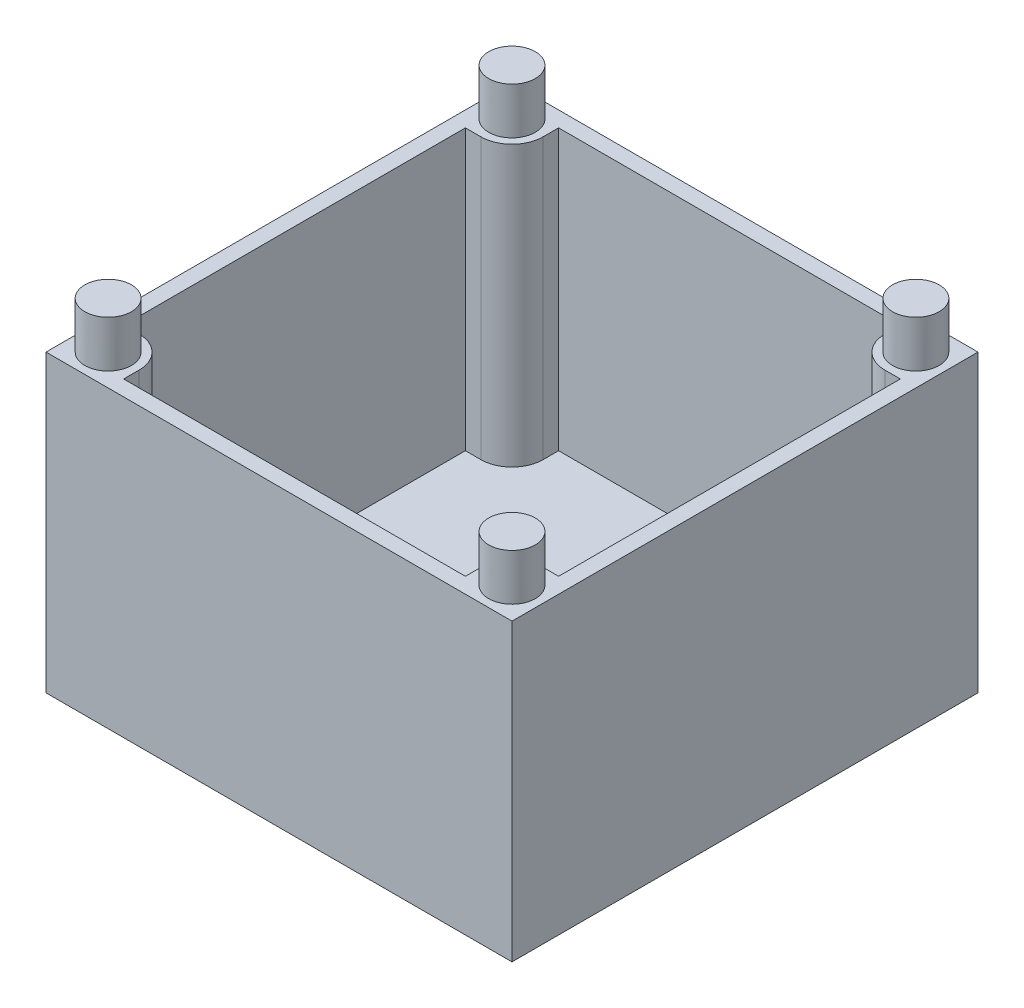
ISO-10303-21;
HEADER;
FILE_DESCRIPTION(('STEP AP214'),'2;1');
FILE_NAME('part.step','',(''),(''),'','','');
FILE_SCHEMA(('AUTOMOTIVE_DESIGN { 1 0 10303 214 1 1 1 1 }'));
ENDSEC;
DATA;
#1=APPLICATION_CONTEXT('core data for automotive mechanical design processes');
#2=APPLICATION_PROTOCOL_DEFINITION('international standard','automotive_design',2000,#1);
#3=PRODUCT_CONTEXT('',#1,'mechanical');
#4=PRODUCT('Part','Part','',(#3));
#5=PRODUCT_RELATED_PRODUCT_CATEGORY('part','',(#4));
#6=PRODUCT_DEFINITION_FORMATION('','',#4);
#7=PRODUCT_DEFINITION_CONTEXT('part definition',#1,'design');
#8=PRODUCT_DEFINITION('design','',#6,#7);
#9=PRODUCT_DEFINITION_SHAPE('','',#8);
#10=(LENGTH_UNIT() NAMED_UNIT(*) SI_UNIT(.MILLI.,.METRE.));
#11=(NAMED_UNIT(*) PLANE_ANGLE_UNIT() SI_UNIT($,.RADIAN.));
#12=(NAMED_UNIT(*) SI_UNIT($,.STERADIAN.) SOLID_ANGLE_UNIT());
#13=UNCERTAINTY_MEASURE_WITH_UNIT(LENGTH_MEASURE(1.E-05),#10,'distance_accuracy_value','');
#14=(GEOMETRIC_REPRESENTATION_CONTEXT(3) GLOBAL_UNCERTAINTY_ASSIGNED_CONTEXT((#13)) GLOBAL_UNIT_ASSIGNED_CONTEXT((#10,
#11,#12)) REPRESENTATION_CONTEXT('',''));
#15=CARTESIAN_POINT('',(0.,0.,0.));
#16=DIRECTION('',(0.,0.,1.));
#17=DIRECTION('',(1.,0.,0.));
#18=AXIS2_PLACEMENT_3D('',#15,#16,#17);
#19=CARTESIAN_POINT('',(-7.5,9.5,-7.5));
#20=DIRECTION('',(0.,-1.,0.));
#21=DIRECTION('',(0.,0.,-1.));
#22=AXIS2_PLACEMENT_3D('',#19,#20,#21);
#23=PLANE('',#22);
#24=CARTESIAN_POINT('',(6.5,9.5,6.5));
#25=DIRECTION('',(0.,-1.,0.));
#26=DIRECTION('',(0.,0.,-1.));
#27=AXIS2_PLACEMENT_3D('',#24,#25,#26);
#28=CIRCLE('',#27,0.749999999999999);
#29=CARTESIAN_POINT('',(6.5,9.5,5.75));
#30=VERTEX_POINT('',#29);
#31=EDGE_CURVE('E44',#30,#30,#28,.F.);
#32=ORIENTED_EDGE('',*,*,#31,.F.);
#33=EDGE_LOOP('',(#32));
#34=FACE_BOUND('',#33,.T.);
#35=CARTESIAN_POINT('',(-6.5,9.5,-6.5));
#36=DIRECTION('',(0.,-1.,0.));
#37=DIRECTION('',(0.,0.,-1.));
#38=AXIS2_PLACEMENT_3D('',#35,#36,#37);
#39=CIRCLE('',#38,0.749999999999999);
#40=CARTESIAN_POINT('',(-6.5,9.5,-7.25));
#41=VERTEX_POINT('',#40);
#42=EDGE_CURVE('E343',#41,#41,#39,.F.);
#43=ORIENTED_EDGE('',*,*,#42,.F.);
#44=EDGE_LOOP('',(#43));
#45=FACE_BOUND('',#44,.T.);
#46=DIRECTION('',(0.,0.,1.));
#47=VECTOR('',#46,1.);
#48=CARTESIAN_POINT('',(-5.5,9.5,6.5));
#49=LINE('',#48,#47);
#50=CARTESIAN_POINT('',(-5.5,9.5,6.5));
#51=VERTEX_POINT('',#50);
#52=CARTESIAN_POINT('',(-5.5,9.5,7.));
#53=VERTEX_POINT('',#52);
#54=EDGE_CURVE('E251',#51,#53,#49,.T.);
#55=ORIENTED_EDGE('',*,*,#54,.F.);
#56=CARTESIAN_POINT('',(-6.5,9.5,6.5));
#57=DIRECTION('',(0.,-1.,0.));
#58=DIRECTION('',(0.,0.,1.));
#59=AXIS2_PLACEMENT_3D('',#56,#57,#58);
#60=CIRCLE('',#59,1.);
#61=CARTESIAN_POINT('',(-6.5,9.5,5.5));
#62=VERTEX_POINT('',#61);
#63=EDGE_CURVE('E51',#62,#51,#60,.T.);
#64=ORIENTED_EDGE('',*,*,#63,.F.);
#65=DIRECTION('',(1.,0.,0.));
#66=VECTOR('',#65,1.);
#67=CARTESIAN_POINT('',(-6.5,9.5,5.5));
#68=LINE('',#67,#66);
#69=CARTESIAN_POINT('',(-7.,9.5,5.5));
#70=VERTEX_POINT('',#69);
#71=EDGE_CURVE('E204',#70,#62,#68,.T.);
#72=ORIENTED_EDGE('',*,*,#71,.F.);
#73=DIRECTION('',(0.,0.,1.));
#74=VECTOR('',#73,1.);
#75=CARTESIAN_POINT('',(-7.,9.5,5.5));
#76=LINE('',#75,#74);
#77=CARTESIAN_POINT('',(-7.,9.5,-5.5));
#78=VERTEX_POINT('',#77);
#79=EDGE_CURVE('E207',#78,#70,#76,.T.);
#80=ORIENTED_EDGE('',*,*,#79,.F.);
#81=DIRECTION('',(-1.,0.,0.));
#82=VECTOR('',#81,1.);
#83=CARTESIAN_POINT('',(-6.5,9.5,-5.5));
#84=LINE('',#83,#82);
#85=CARTESIAN_POINT('',(-6.5,9.5,-5.5));
#86=VERTEX_POINT('',#85);
#87=EDGE_CURVE('E286',#86,#78,#84,.T.);
#88=ORIENTED_EDGE('',*,*,#87,.F.);
#89=CARTESIAN_POINT('',(-6.5,9.5,-6.5));
#90=DIRECTION('',(0.,-1.,0.));
#91=DIRECTION('',(0.,0.,1.));
#92=AXIS2_PLACEMENT_3D('',#89,#90,#91);
#93=CIRCLE('',#92,1.);
#94=CARTESIAN_POINT('',(-5.5,9.5,-6.5));
#95=VERTEX_POINT('',#94);
#96=EDGE_CURVE('E283',#95,#86,#93,.T.);
#97=ORIENTED_EDGE('',*,*,#96,.F.);
#98=DIRECTION('',(0.,0.,1.));
#99=VECTOR('',#98,1.);
#100=CARTESIAN_POINT('',(-5.5,9.5,-6.5));
#101=LINE('',#100,#99);
#102=CARTESIAN_POINT('',(-5.5,9.5,-7.));
#103=VERTEX_POINT('',#102);
#104=EDGE_CURVE('E280',#103,#95,#101,.T.);
#105=ORIENTED_EDGE('',*,*,#104,.F.);
#106=DIRECTION('',(-1.,0.,0.));
#107=VECTOR('',#106,1.);
#108=CARTESIAN_POINT('',(-5.5,9.5,-7.));
#109=LINE('',#108,#107);
#110=CARTESIAN_POINT('',(5.5,9.5,-7.));
#111=VERTEX_POINT('',#110);
#112=EDGE_CURVE('E277',#111,#103,#109,.T.);
#113=ORIENTED_EDGE('',*,*,#112,.F.);
#114=DIRECTION('',(0.,0.,-1.));
#115=VECTOR('',#114,1.);
#116=CARTESIAN_POINT('',(5.5,9.5,-6.5));
#117=LINE('',#116,#115);
#118=CARTESIAN_POINT('',(5.5,9.5,-6.5));
#119=VERTEX_POINT('',#118);
#120=EDGE_CURVE('E274',#119,#111,#117,.T.);
#121=ORIENTED_EDGE('',*,*,#120,.F.);
#122=CARTESIAN_POINT('',(6.5,9.5,-6.5));
#123=DIRECTION('',(0.,-1.,0.));
#124=DIRECTION('',(0.,0.,1.));
#125=AXIS2_PLACEMENT_3D('',#122,#123,#124);
#126=CIRCLE('',#125,1.);
#127=CARTESIAN_POINT('',(6.5,9.5,-5.5));
#128=VERTEX_POINT('',#127);
#129=EDGE_CURVE('E271',#128,#119,#126,.T.);
#130=ORIENTED_EDGE('',*,*,#129,.F.);
#131=DIRECTION('',(-1.,0.,0.));
#132=VECTOR('',#131,1.);
#133=CARTESIAN_POINT('',(6.5,9.5,-5.5));
#134=LINE('',#133,#132);
#135=CARTESIAN_POINT('',(7.,9.5,-5.5));
#136=VERTEX_POINT('',#135);
#137=EDGE_CURVE('E268',#136,#128,#134,.T.);
#138=ORIENTED_EDGE('',*,*,#137,.F.);
#139=DIRECTION('',(0.,0.,-1.));
#140=VECTOR('',#139,1.);
#141=CARTESIAN_POINT('',(7.,9.5,5.5));
#142=LINE('',#141,#140);
#143=CARTESIAN_POINT('',(7.,9.5,5.5));
#144=VERTEX_POINT('',#143);
#145=EDGE_CURVE('E265',#144,#136,#142,.T.);
#146=ORIENTED_EDGE('',*,*,#145,.F.);
#147=DIRECTION('',(1.,0.,0.));
#148=VECTOR('',#147,1.);
#149=CARTESIAN_POINT('',(6.5,9.5,5.5));
#150=LINE('',#149,#148);
#151=CARTESIAN_POINT('',(6.5,9.5,5.5));
#152=VERTEX_POINT('',#151);
#153=EDGE_CURVE('E262',#152,#144,#150,.T.);
#154=ORIENTED_EDGE('',*,*,#153,.F.);
#155=CARTESIAN_POINT('',(6.5,9.5,6.5));
#156=DIRECTION('',(0.,-1.,0.));
#157=DIRECTION('',(0.,0.,1.));
#158=AXIS2_PLACEMENT_3D('',#155,#156,#157);
#159=CIRCLE('',#158,1.);
#160=CARTESIAN_POINT('',(5.5,9.5,6.5));
#161=VERTEX_POINT('',#160);
#162=EDGE_CURVE('E259',#161,#152,#159,.T.);
#163=ORIENTED_EDGE('',*,*,#162,.F.);
#164=DIRECTION('',(0.,0.,-1.));
#165=VECTOR('',#164,1.);
#166=CARTESIAN_POINT('',(5.5,9.5,6.5));
#167=LINE('',#166,#165);
#168=CARTESIAN_POINT('',(5.5,9.5,7.));
#169=VERTEX_POINT('',#168);
#170=EDGE_CURVE('E256',#169,#161,#167,.T.);
#171=ORIENTED_EDGE('',*,*,#170,.F.);
#172=DIRECTION('',(1.,0.,0.));
#173=VECTOR('',#172,1.);
#174=CARTESIAN_POINT('',(-5.5,9.5,7.));
#175=LINE('',#174,#173);
#176=EDGE_CURVE('E253',#53,#169,#175,.T.);
#177=ORIENTED_EDGE('',*,*,#176,.F.);
#178=EDGE_LOOP('',(#55,#64,#72,#80,#88,#97,#105,#113,#121,#130,#138,#146,#154,#163,#171,#177));
#179=FACE_BOUND('',#178,.T.);
#180=DIRECTION('',(0.,0.,1.));
#181=VECTOR('',#180,1.);
#182=CARTESIAN_POINT('',(-7.5,9.5,7.5));
#183=LINE('',#182,#181);
#184=CARTESIAN_POINT('',(-7.5,9.5,-7.5));
#185=VERTEX_POINT('',#184);
#186=CARTESIAN_POINT('',(-7.5,9.5,7.5));
#187=VERTEX_POINT('',#186);
#188=EDGE_CURVE('E321',#185,#187,#183,.T.);
#189=ORIENTED_EDGE('',*,*,#188,.T.);
#190=DIRECTION('',(1.,0.,0.));
#191=VECTOR('',#190,1.);
#192=CARTESIAN_POINT('',(-7.5,9.5,7.5));
#193=LINE('',#192,#191);
#194=CARTESIAN_POINT('',(7.5,9.5,7.5));
#195=VERTEX_POINT('',#194);
#196=EDGE_CURVE('E89',#187,#195,#193,.T.);
#197=ORIENTED_EDGE('',*,*,#196,.T.);
#198=DIRECTION('',(0.,0.,-1.));
#199=VECTOR('',#198,1.);
#200=CARTESIAN_POINT('',(7.5,9.5,7.5));
#201=LINE('',#200,#199);
#202=CARTESIAN_POINT('',(7.5,9.5,-7.5));
#203=VERTEX_POINT('',#202);
#204=EDGE_CURVE('E324',#195,#203,#201,.T.);
#205=ORIENTED_EDGE('',*,*,#204,.T.);
#206=DIRECTION('',(-1.,0.,0.));
#207=VECTOR('',#206,1.);
#208=CARTESIAN_POINT('',(-7.5,9.5,-7.5));
#209=LINE('',#208,#207);
#210=EDGE_CURVE('E60',#203,#185,#209,.T.);
#211=ORIENTED_EDGE('',*,*,#210,.T.);
#212=EDGE_LOOP('',(#189,#197,#205,#211));
#213=FACE_BOUND('',#212,.T.);
#214=CARTESIAN_POINT('',(-6.5,9.5,6.5));
#215=DIRECTION('',(0.,-1.,0.));
#216=DIRECTION('',(0.,0.,-1.));
#217=AXIS2_PLACEMENT_3D('',#214,#215,#216);
#218=CIRCLE('',#217,0.749999999999999);
#219=CARTESIAN_POINT('',(-6.5,9.5,5.75));
#220=VERTEX_POINT('',#219);
#221=EDGE_CURVE('E346',#220,#220,#218,.F.);
#222=ORIENTED_EDGE('',*,*,#221,.F.);
#223=EDGE_LOOP('',(#222));
#224=FACE_BOUND('',#223,.T.);
#225=CARTESIAN_POINT('',(6.5,9.5,-6.5));
#226=DIRECTION('',(0.,-1.,0.));
#227=DIRECTION('',(0.,0.,-1.));
#228=AXIS2_PLACEMENT_3D('',#225,#226,#227);
#229=CIRCLE('',#228,0.749999999999999);
#230=CARTESIAN_POINT('',(6.5,9.5,-7.25));
#231=VERTEX_POINT('',#230);
#232=EDGE_CURVE('E11',#231,#231,#229,.F.);
#233=ORIENTED_EDGE('',*,*,#232,.F.);
#234=EDGE_LOOP('',(#233));
#235=FACE_BOUND('',#234,.T.);
#236=ADVANCED_FACE('F36',(#34,#45,#179,#213,#224,#235),#23,.F.);
#237=CARTESIAN_POINT('',(-7.5,9.5,7.5));
#238=DIRECTION('',(1.,0.,0.));
#239=DIRECTION('',(0.,0.,-1.));
#240=AXIS2_PLACEMENT_3D('',#237,#238,#239);
#241=PLANE('',#240);
#242=DIRECTION('',(0.,0.,1.));
#243=VECTOR('',#242,1.);
#244=CARTESIAN_POINT('',(-7.5,0.,7.5));
#245=LINE('',#244,#243);
#246=CARTESIAN_POINT('',(-7.5,0.,-7.5));
#247=VERTEX_POINT('',#246);
#248=CARTESIAN_POINT('',(-7.5,0.,7.5));
#249=VERTEX_POINT('',#248);
#250=EDGE_CURVE('E293',#247,#249,#245,.T.);
#251=ORIENTED_EDGE('',*,*,#250,.T.);
#252=DIRECTION('',(0.,-1.,0.));
#253=VECTOR('',#252,1.);
#254=CARTESIAN_POINT('',(-7.5,9.5,7.5));
#255=LINE('',#254,#253);
#256=EDGE_CURVE('E341',#187,#249,#255,.T.);
#257=ORIENTED_EDGE('',*,*,#256,.F.);
#258=ORIENTED_EDGE('',*,*,#188,.F.);
#259=DIRECTION('',(0.,-1.,0.));
#260=VECTOR('',#259,1.);
#261=CARTESIAN_POINT('',(-7.5,9.5,-7.5));
#262=LINE('',#261,#260);
#263=EDGE_CURVE('E327',#185,#247,#262,.T.);
#264=ORIENTED_EDGE('',*,*,#263,.T.);
#265=EDGE_LOOP('',(#251,#257,#258,#264));
#266=FACE_BOUND('',#265,.T.);
#267=ADVANCED_FACE('F38',(#266),#241,.F.);
#268=CARTESIAN_POINT('',(-7.5,9.5,7.5));
#269=DIRECTION('',(0.,0.,-1.));
#270=DIRECTION('',(-1.,0.,0.));
#271=AXIS2_PLACEMENT_3D('',#268,#269,#270);
#272=PLANE('',#271);
#273=DIRECTION('',(1.,0.,0.));
#274=VECTOR('',#273,1.);
#275=CARTESIAN_POINT('',(-7.5,0.,7.5));
#276=LINE('',#275,#274);
#277=CARTESIAN_POINT('',(7.5,0.,7.5));
#278=VERTEX_POINT('',#277);
#279=EDGE_CURVE('E330',#249,#278,#276,.T.);
#280=ORIENTED_EDGE('',*,*,#279,.T.);
#281=DIRECTION('',(0.,-1.,0.));
#282=VECTOR('',#281,1.);
#283=CARTESIAN_POINT('',(7.5,9.5,7.5));
#284=LINE('',#283,#282);
#285=EDGE_CURVE('E338',#195,#278,#284,.T.);
#286=ORIENTED_EDGE('',*,*,#285,.F.);
#287=ORIENTED_EDGE('',*,*,#196,.F.);
#288=ORIENTED_EDGE('',*,*,#256,.T.);
#289=EDGE_LOOP('',(#280,#286,#287,#288));
#290=FACE_BOUND('',#289,.T.);
#291=ADVANCED_FACE('F472',(#290),#272,.F.);
#292=CARTESIAN_POINT('',(7.5,9.5,7.5));
#293=DIRECTION('',(-1.,0.,0.));
#294=DIRECTION('',(0.,0.,1.));
#295=AXIS2_PLACEMENT_3D('',#292,#293,#294);
#296=PLANE('',#295);
#297=DIRECTION('',(0.,0.,-1.));
#298=VECTOR('',#297,1.);
#299=CARTESIAN_POINT('',(7.5,0.,7.5));
#300=LINE('',#299,#298);
#301=CARTESIAN_POINT('',(7.5,0.,-7.5));
#302=VERTEX_POINT('',#301);
#303=EDGE_CURVE('E332',#278,#302,#300,.T.);
#304=ORIENTED_EDGE('',*,*,#303,.T.);
#305=DIRECTION('',(0.,-1.,0.));
#306=VECTOR('',#305,1.);
#307=CARTESIAN_POINT('',(7.5,9.5,-7.5));
#308=LINE('',#307,#306);
#309=EDGE_CURVE('E336',#203,#302,#308,.T.);
#310=ORIENTED_EDGE('',*,*,#309,.F.);
#311=ORIENTED_EDGE('',*,*,#204,.F.);
#312=ORIENTED_EDGE('',*,*,#285,.T.);
#313=EDGE_LOOP('',(#304,#310,#311,#312));
#314=FACE_BOUND('',#313,.T.);
#315=ADVANCED_FACE('F470',(#314),#296,.F.);
#316=CARTESIAN_POINT('',(-7.5,9.5,-7.5));
#317=DIRECTION('',(0.,0.,1.));
#318=DIRECTION('',(1.,0.,0.));
#319=AXIS2_PLACEMENT_3D('',#316,#317,#318);
#320=PLANE('',#319);
#321=DIRECTION('',(-1.,0.,0.));
#322=VECTOR('',#321,1.);
#323=CARTESIAN_POINT('',(-7.5,0.,-7.5));
#324=LINE('',#323,#322);
#325=EDGE_CURVE('E81',#302,#247,#324,.T.);
#326=ORIENTED_EDGE('',*,*,#325,.T.);
#327=ORIENTED_EDGE('',*,*,#263,.F.);
#328=ORIENTED_EDGE('',*,*,#210,.F.);
#329=ORIENTED_EDGE('',*,*,#309,.T.);
#330=EDGE_LOOP('',(#326,#327,#328,#329));
#331=FACE_BOUND('',#330,.T.);
#332=ADVANCED_FACE('F466',(#331),#320,.F.);
#333=CARTESIAN_POINT('',(-7.5,0.,-7.5));
#334=DIRECTION('',(0.,-1.,0.));
#335=DIRECTION('',(0.,0.,-1.));
#336=AXIS2_PLACEMENT_3D('',#333,#334,#335);
#337=PLANE('',#336);
#338=ORIENTED_EDGE('',*,*,#250,.F.);
#339=ORIENTED_EDGE('',*,*,#325,.F.);
#340=ORIENTED_EDGE('',*,*,#303,.F.);
#341=ORIENTED_EDGE('',*,*,#279,.F.);
#342=EDGE_LOOP('',(#338,#339,#340,#341));
#343=FACE_BOUND('',#342,.T.);
#344=ADVANCED_FACE('F462',(#343),#337,.T.);
#345=CARTESIAN_POINT('',(-6.5,0.5,6.5));
#346=DIRECTION('',(0.,1.,0.));
#347=DIRECTION('',(0.,0.,1.));
#348=AXIS2_PLACEMENT_3D('',#345,#346,#347);
#349=CYLINDRICAL_SURFACE('',#348,1.);
#350=ORIENTED_EDGE('',*,*,#63,.T.);
#351=DIRECTION('',(0.,1.,0.));
#352=VECTOR('',#351,1.);
#353=CARTESIAN_POINT('',(-5.5,0.5,6.5));
#354=LINE('',#353,#352);
#355=CARTESIAN_POINT('',(-5.5,0.5,6.5));
#356=VERTEX_POINT('',#355);
#357=EDGE_CURVE('E181',#356,#51,#354,.T.);
#358=ORIENTED_EDGE('',*,*,#357,.F.);
#359=CARTESIAN_POINT('',(-6.5,0.5,6.5));
#360=DIRECTION('',(0.,-1.,0.));
#361=DIRECTION('',(0.,0.,1.));
#362=AXIS2_PLACEMENT_3D('',#359,#360,#361);
#363=CIRCLE('',#362,1.);
#364=CARTESIAN_POINT('',(-6.5,0.5,5.5));
#365=VERTEX_POINT('',#364);
#366=EDGE_CURVE('E185',#365,#356,#363,.T.);
#367=ORIENTED_EDGE('',*,*,#366,.F.);
#368=DIRECTION('',(0.,1.,0.));
#369=VECTOR('',#368,1.);
#370=CARTESIAN_POINT('',(-6.5,0.5,5.5));
#371=LINE('',#370,#369);
#372=EDGE_CURVE('E291',#365,#62,#371,.T.);
#373=ORIENTED_EDGE('',*,*,#372,.T.);
#374=EDGE_LOOP('',(#350,#358,#367,#373));
#375=FACE_BOUND('',#374,.T.);
#376=ADVANCED_FACE('F183',(#375),#349,.T.);
#377=CARTESIAN_POINT('',(-6.5,0.5,5.5));
#378=DIRECTION('',(0.,0.,1.));
#379=DIRECTION('',(1.,0.,0.));
#380=AXIS2_PLACEMENT_3D('',#377,#378,#379);
#381=PLANE('',#380);
#382=ORIENTED_EDGE('',*,*,#71,.T.);
#383=ORIENTED_EDGE('',*,*,#372,.F.);
#384=DIRECTION('',(1.,0.,0.));
#385=VECTOR('',#384,1.);
#386=CARTESIAN_POINT('',(-6.5,0.5,5.5));
#387=LINE('',#386,#385);
#388=CARTESIAN_POINT('',(-7.,0.5,5.5));
#389=VERTEX_POINT('',#388);
#390=EDGE_CURVE('E191',#389,#365,#387,.T.);
#391=ORIENTED_EDGE('',*,*,#390,.F.);
#392=DIRECTION('',(0.,1.,0.));
#393=VECTOR('',#392,1.);
#394=CARTESIAN_POINT('',(-7.,0.5,5.5));
#395=LINE('',#394,#393);
#396=EDGE_CURVE('E294',#389,#70,#395,.T.);
#397=ORIENTED_EDGE('',*,*,#396,.T.);
#398=EDGE_LOOP('',(#382,#383,#391,#397));
#399=FACE_BOUND('',#398,.T.);
#400=ADVANCED_FACE('F403',(#399),#381,.F.);
#401=CARTESIAN_POINT('',(-7.,0.5,5.5));
#402=DIRECTION('',(-1.,0.,0.));
#403=DIRECTION('',(0.,0.,1.));
#404=AXIS2_PLACEMENT_3D('',#401,#402,#403);
#405=PLANE('',#404);
#406=ORIENTED_EDGE('',*,*,#79,.T.);
#407=ORIENTED_EDGE('',*,*,#396,.F.);
#408=DIRECTION('',(0.,0.,1.));
#409=VECTOR('',#408,1.);
#410=CARTESIAN_POINT('',(-7.,0.5,5.5));
#411=LINE('',#410,#409);
#412=CARTESIAN_POINT('',(-7.,0.5,-5.5));
#413=VERTEX_POINT('',#412);
#414=EDGE_CURVE('E247',#413,#389,#411,.T.);
#415=ORIENTED_EDGE('',*,*,#414,.F.);
#416=DIRECTION('',(0.,1.,0.));
#417=VECTOR('',#416,1.);
#418=CARTESIAN_POINT('',(-7.,0.5,-5.5));
#419=LINE('',#418,#417);
#420=EDGE_CURVE('E296',#413,#78,#419,.T.);
#421=ORIENTED_EDGE('',*,*,#420,.T.);
#422=EDGE_LOOP('',(#406,#407,#415,#421));
#423=FACE_BOUND('',#422,.T.);
#424=ADVANCED_FACE('F406',(#423),#405,.F.);
#425=CARTESIAN_POINT('',(-6.5,0.5,-5.5));
#426=DIRECTION('',(0.,0.,-1.));
#427=DIRECTION('',(-1.,0.,0.));
#428=AXIS2_PLACEMENT_3D('',#425,#426,#427);
#429=PLANE('',#428);
#430=ORIENTED_EDGE('',*,*,#87,.T.);
#431=ORIENTED_EDGE('',*,*,#420,.F.);
#432=DIRECTION('',(-1.,0.,0.));
#433=VECTOR('',#432,1.);
#434=CARTESIAN_POINT('',(-6.5,0.5,-5.5));
#435=LINE('',#434,#433);
#436=CARTESIAN_POINT('',(-6.5,0.5,-5.5));
#437=VERTEX_POINT('',#436);
#438=EDGE_CURVE('E244',#437,#413,#435,.T.);
#439=ORIENTED_EDGE('',*,*,#438,.F.);
#440=DIRECTION('',(0.,1.,0.));
#441=VECTOR('',#440,1.);
#442=CARTESIAN_POINT('',(-6.5,0.5,-5.5));
#443=LINE('',#442,#441);
#444=EDGE_CURVE('E298',#437,#86,#443,.T.);
#445=ORIENTED_EDGE('',*,*,#444,.T.);
#446=EDGE_LOOP('',(#430,#431,#439,#445));
#447=FACE_BOUND('',#446,.T.);
#448=ADVANCED_FACE('F410',(#447),#429,.F.);
#449=CARTESIAN_POINT('',(-6.5,0.5,-6.5));
#450=DIRECTION('',(0.,1.,0.));
#451=DIRECTION('',(0.,0.,1.));
#452=AXIS2_PLACEMENT_3D('',#449,#450,#451);
#453=CYLINDRICAL_SURFACE('',#452,1.);
#454=ORIENTED_EDGE('',*,*,#96,.T.);
#455=ORIENTED_EDGE('',*,*,#444,.F.);
#456=CARTESIAN_POINT('',(-6.5,0.5,-6.5));
#457=DIRECTION('',(0.,-1.,0.));
#458=DIRECTION('',(0.,0.,1.));
#459=AXIS2_PLACEMENT_3D('',#456,#457,#458);
#460=CIRCLE('',#459,1.);
#461=CARTESIAN_POINT('',(-5.5,0.5,-6.5));
#462=VERTEX_POINT('',#461);
#463=EDGE_CURVE('E241',#462,#437,#460,.T.);
#464=ORIENTED_EDGE('',*,*,#463,.F.);
#465=DIRECTION('',(0.,1.,0.));
#466=VECTOR('',#465,1.);
#467=CARTESIAN_POINT('',(-5.5,0.5,-6.5));
#468=LINE('',#467,#466);
#469=EDGE_CURVE('E300',#462,#95,#468,.T.);
#470=ORIENTED_EDGE('',*,*,#469,.T.);
#471=EDGE_LOOP('',(#454,#455,#464,#470));
#472=FACE_BOUND('',#471,.T.);
#473=ADVANCED_FACE('F414',(#472),#453,.T.);
#474=CARTESIAN_POINT('',(-5.5,0.5,-6.5));
#475=DIRECTION('',(-1.,0.,0.));
#476=DIRECTION('',(0.,0.,1.));
#477=AXIS2_PLACEMENT_3D('',#474,#475,#476);
#478=PLANE('',#477);
#479=ORIENTED_EDGE('',*,*,#104,.T.);
#480=ORIENTED_EDGE('',*,*,#469,.F.);
#481=DIRECTION('',(0.,0.,1.));
#482=VECTOR('',#481,1.);
#483=CARTESIAN_POINT('',(-5.5,0.5,-6.5));
#484=LINE('',#483,#482);
#485=CARTESIAN_POINT('',(-5.5,0.5,-7.));
#486=VERTEX_POINT('',#485);
#487=EDGE_CURVE('E238',#486,#462,#484,.T.);
#488=ORIENTED_EDGE('',*,*,#487,.F.);
#489=DIRECTION('',(0.,1.,0.));
#490=VECTOR('',#489,1.);
#491=CARTESIAN_POINT('',(-5.5,0.5,-7.));
#492=LINE('',#491,#490);
#493=EDGE_CURVE('E302',#486,#103,#492,.T.);
#494=ORIENTED_EDGE('',*,*,#493,.T.);
#495=EDGE_LOOP('',(#479,#480,#488,#494));
#496=FACE_BOUND('',#495,.T.);
#497=ADVANCED_FACE('F418',(#496),#478,.F.);
#498=CARTESIAN_POINT('',(-5.5,0.5,-7.));
#499=DIRECTION('',(0.,0.,-1.));
#500=DIRECTION('',(-1.,0.,0.));
#501=AXIS2_PLACEMENT_3D('',#498,#499,#500);
#502=PLANE('',#501);
#503=ORIENTED_EDGE('',*,*,#112,.T.);
#504=ORIENTED_EDGE('',*,*,#493,.F.);
#505=DIRECTION('',(-1.,0.,0.));
#506=VECTOR('',#505,1.);
#507=CARTESIAN_POINT('',(-5.5,0.5,-7.));
#508=LINE('',#507,#506);
#509=CARTESIAN_POINT('',(5.5,0.5,-7.));
#510=VERTEX_POINT('',#509);
#511=EDGE_CURVE('E235',#510,#486,#508,.T.);
#512=ORIENTED_EDGE('',*,*,#511,.F.);
#513=DIRECTION('',(0.,1.,0.));
#514=VECTOR('',#513,1.);
#515=CARTESIAN_POINT('',(5.5,0.5,-7.));
#516=LINE('',#515,#514);
#517=EDGE_CURVE('E304',#510,#111,#516,.T.);
#518=ORIENTED_EDGE('',*,*,#517,.T.);
#519=EDGE_LOOP('',(#503,#504,#512,#518));
#520=FACE_BOUND('',#519,.T.);
#521=ADVANCED_FACE('F422',(#520),#502,.F.);
#522=CARTESIAN_POINT('',(5.5,0.5,-6.5));
#523=DIRECTION('',(1.,0.,0.));
#524=DIRECTION('',(0.,0.,-1.));
#525=AXIS2_PLACEMENT_3D('',#522,#523,#524);
#526=PLANE('',#525);
#527=ORIENTED_EDGE('',*,*,#120,.T.);
#528=ORIENTED_EDGE('',*,*,#517,.F.);
#529=DIRECTION('',(0.,0.,-1.));
#530=VECTOR('',#529,1.);
#531=CARTESIAN_POINT('',(5.5,0.5,-6.5));
#532=LINE('',#531,#530);
#533=CARTESIAN_POINT('',(5.5,0.5,-6.5));
#534=VERTEX_POINT('',#533);
#535=EDGE_CURVE('E232',#534,#510,#532,.T.);
#536=ORIENTED_EDGE('',*,*,#535,.F.);
#537=DIRECTION('',(0.,1.,0.));
#538=VECTOR('',#537,1.);
#539=CARTESIAN_POINT('',(5.5,0.5,-6.5));
#540=LINE('',#539,#538);
#541=EDGE_CURVE('E306',#534,#119,#540,.T.);
#542=ORIENTED_EDGE('',*,*,#541,.T.);
#543=EDGE_LOOP('',(#527,#528,#536,#542));
#544=FACE_BOUND('',#543,.T.);
#545=ADVANCED_FACE('F426',(#544),#526,.F.);
#546=CARTESIAN_POINT('',(6.5,0.5,-6.5));
#547=DIRECTION('',(0.,1.,0.));
#548=DIRECTION('',(0.,0.,1.));
#549=AXIS2_PLACEMENT_3D('',#546,#547,#548);
#550=CYLINDRICAL_SURFACE('',#549,1.);
#551=ORIENTED_EDGE('',*,*,#129,.T.);
#552=ORIENTED_EDGE('',*,*,#541,.F.);
#553=CARTESIAN_POINT('',(6.5,0.5,-6.5));
#554=DIRECTION('',(0.,-1.,0.));
#555=DIRECTION('',(0.,0.,1.));
#556=AXIS2_PLACEMENT_3D('',#553,#554,#555);
#557=CIRCLE('',#556,1.);
#558=CARTESIAN_POINT('',(6.5,0.5,-5.5));
#559=VERTEX_POINT('',#558);
#560=EDGE_CURVE('E229',#559,#534,#557,.T.);
#561=ORIENTED_EDGE('',*,*,#560,.F.);
#562=DIRECTION('',(0.,1.,0.));
#563=VECTOR('',#562,1.);
#564=CARTESIAN_POINT('',(6.5,0.5,-5.5));
#565=LINE('',#564,#563);
#566=EDGE_CURVE('E308',#559,#128,#565,.T.);
#567=ORIENTED_EDGE('',*,*,#566,.T.);
#568=EDGE_LOOP('',(#551,#552,#561,#567));
#569=FACE_BOUND('',#568,.T.);
#570=ADVANCED_FACE('F430',(#569),#550,.T.);
#571=CARTESIAN_POINT('',(6.5,0.5,-5.5));
#572=DIRECTION('',(0.,0.,-1.));
#573=DIRECTION('',(-1.,0.,0.));
#574=AXIS2_PLACEMENT_3D('',#571,#572,#573);
#575=PLANE('',#574);
#576=ORIENTED_EDGE('',*,*,#137,.T.);
#577=ORIENTED_EDGE('',*,*,#566,.F.);
#578=DIRECTION('',(-1.,0.,0.));
#579=VECTOR('',#578,1.);
#580=CARTESIAN_POINT('',(6.5,0.5,-5.5));
#581=LINE('',#580,#579);
#582=CARTESIAN_POINT('',(7.,0.5,-5.5));
#583=VERTEX_POINT('',#582);
#584=EDGE_CURVE('E226',#583,#559,#581,.T.);
#585=ORIENTED_EDGE('',*,*,#584,.F.);
#586=DIRECTION('',(0.,1.,0.));
#587=VECTOR('',#586,1.);
#588=CARTESIAN_POINT('',(7.,0.5,-5.5));
#589=LINE('',#588,#587);
#590=EDGE_CURVE('E310',#583,#136,#589,.T.);
#591=ORIENTED_EDGE('',*,*,#590,.T.);
#592=EDGE_LOOP('',(#576,#577,#585,#591));
#593=FACE_BOUND('',#592,.T.);
#594=ADVANCED_FACE('F434',(#593),#575,.F.);
#595=CARTESIAN_POINT('',(7.,0.5,5.5));
#596=DIRECTION('',(1.,0.,0.));
#597=DIRECTION('',(0.,0.,-1.));
#598=AXIS2_PLACEMENT_3D('',#595,#596,#597);
#599=PLANE('',#598);
#600=ORIENTED_EDGE('',*,*,#145,.T.);
#601=ORIENTED_EDGE('',*,*,#590,.F.);
#602=DIRECTION('',(0.,0.,-1.));
#603=VECTOR('',#602,1.);
#604=CARTESIAN_POINT('',(7.,0.5,5.5));
#605=LINE('',#604,#603);
#606=CARTESIAN_POINT('',(7.,0.5,5.5));
#607=VERTEX_POINT('',#606);
#608=EDGE_CURVE('E223',#607,#583,#605,.T.);
#609=ORIENTED_EDGE('',*,*,#608,.F.);
#610=DIRECTION('',(0.,1.,0.));
#611=VECTOR('',#610,1.);
#612=CARTESIAN_POINT('',(7.,0.5,5.5));
#613=LINE('',#612,#611);
#614=EDGE_CURVE('E312',#607,#144,#613,.T.);
#615=ORIENTED_EDGE('',*,*,#614,.T.);
#616=EDGE_LOOP('',(#600,#601,#609,#615));
#617=FACE_BOUND('',#616,.T.);
#618=ADVANCED_FACE('F438',(#617),#599,.F.);
#619=CARTESIAN_POINT('',(6.5,0.5,5.5));
#620=DIRECTION('',(0.,0.,1.));
#621=DIRECTION('',(1.,0.,0.));
#622=AXIS2_PLACEMENT_3D('',#619,#620,#621);
#623=PLANE('',#622);
#624=ORIENTED_EDGE('',*,*,#153,.T.);
#625=ORIENTED_EDGE('',*,*,#614,.F.);
#626=DIRECTION('',(1.,0.,0.));
#627=VECTOR('',#626,1.);
#628=CARTESIAN_POINT('',(6.5,0.5,5.5));
#629=LINE('',#628,#627);
#630=CARTESIAN_POINT('',(6.5,0.5,5.5));
#631=VERTEX_POINT('',#630);
#632=EDGE_CURVE('E220',#631,#607,#629,.T.);
#633=ORIENTED_EDGE('',*,*,#632,.F.);
#634=DIRECTION('',(0.,1.,0.));
#635=VECTOR('',#634,1.);
#636=CARTESIAN_POINT('',(6.5,0.5,5.5));
#637=LINE('',#636,#635);
#638=EDGE_CURVE('E314',#631,#152,#637,.T.);
#639=ORIENTED_EDGE('',*,*,#638,.T.);
#640=EDGE_LOOP('',(#624,#625,#633,#639));
#641=FACE_BOUND('',#640,.T.);
#642=ADVANCED_FACE('F442',(#641),#623,.F.);
#643=CARTESIAN_POINT('',(6.5,0.5,6.5));
#644=DIRECTION('',(0.,1.,0.));
#645=DIRECTION('',(0.,0.,1.));
#646=AXIS2_PLACEMENT_3D('',#643,#644,#645);
#647=CYLINDRICAL_SURFACE('',#646,1.);
#648=ORIENTED_EDGE('',*,*,#162,.T.);
#649=ORIENTED_EDGE('',*,*,#638,.F.);
#650=CARTESIAN_POINT('',(6.5,0.5,6.5));
#651=DIRECTION('',(0.,-1.,0.));
#652=DIRECTION('',(0.,0.,1.));
#653=AXIS2_PLACEMENT_3D('',#650,#651,#652);
#654=CIRCLE('',#653,1.);
#655=CARTESIAN_POINT('',(5.5,0.5,6.5));
#656=VERTEX_POINT('',#655);
#657=EDGE_CURVE('E217',#656,#631,#654,.T.);
#658=ORIENTED_EDGE('',*,*,#657,.F.);
#659=DIRECTION('',(0.,1.,0.));
#660=VECTOR('',#659,1.);
#661=CARTESIAN_POINT('',(5.5,0.5,6.5));
#662=LINE('',#661,#660);
#663=EDGE_CURVE('E316',#656,#161,#662,.T.);
#664=ORIENTED_EDGE('',*,*,#663,.T.);
#665=EDGE_LOOP('',(#648,#649,#658,#664));
#666=FACE_BOUND('',#665,.T.);
#667=ADVANCED_FACE('F446',(#666),#647,.T.);
#668=CARTESIAN_POINT('',(5.5,0.5,6.5));
#669=DIRECTION('',(1.,0.,0.));
#670=DIRECTION('',(0.,0.,-1.));
#671=AXIS2_PLACEMENT_3D('',#668,#669,#670);
#672=PLANE('',#671);
#673=ORIENTED_EDGE('',*,*,#170,.T.);
#674=ORIENTED_EDGE('',*,*,#663,.F.);
#675=DIRECTION('',(0.,0.,-1.));
#676=VECTOR('',#675,1.);
#677=CARTESIAN_POINT('',(5.5,0.5,6.5));
#678=LINE('',#677,#676);
#679=CARTESIAN_POINT('',(5.5,0.5,7.));
#680=VERTEX_POINT('',#679);
#681=EDGE_CURVE('E214',#680,#656,#678,.T.);
#682=ORIENTED_EDGE('',*,*,#681,.F.);
#683=DIRECTION('',(0.,1.,0.));
#684=VECTOR('',#683,1.);
#685=CARTESIAN_POINT('',(5.5,0.5,7.));
#686=LINE('',#685,#684);
#687=EDGE_CURVE('E318',#680,#169,#686,.T.);
#688=ORIENTED_EDGE('',*,*,#687,.T.);
#689=EDGE_LOOP('',(#673,#674,#682,#688));
#690=FACE_BOUND('',#689,.T.);
#691=ADVANCED_FACE('F450',(#690),#672,.F.);
#692=CARTESIAN_POINT('',(-5.5,0.5,7.));
#693=DIRECTION('',(0.,0.,1.));
#694=DIRECTION('',(1.,0.,0.));
#695=AXIS2_PLACEMENT_3D('',#692,#693,#694);
#696=PLANE('',#695);
#697=ORIENTED_EDGE('',*,*,#176,.T.);
#698=ORIENTED_EDGE('',*,*,#687,.F.);
#699=DIRECTION('',(1.,0.,0.));
#700=VECTOR('',#699,1.);
#701=CARTESIAN_POINT('',(-5.5,0.5,7.));
#702=LINE('',#701,#700);
#703=CARTESIAN_POINT('',(-5.5,0.5,7.));
#704=VERTEX_POINT('',#703);
#705=EDGE_CURVE('E199',#704,#680,#702,.T.);
#706=ORIENTED_EDGE('',*,*,#705,.F.);
#707=DIRECTION('',(0.,1.,0.));
#708=VECTOR('',#707,1.);
#709=CARTESIAN_POINT('',(-5.5,0.5,7.));
#710=LINE('',#709,#708);
#711=EDGE_CURVE('E190',#704,#53,#710,.T.);
#712=ORIENTED_EDGE('',*,*,#711,.T.);
#713=EDGE_LOOP('',(#697,#698,#706,#712));
#714=FACE_BOUND('',#713,.T.);
#715=ADVANCED_FACE('F454',(#714),#696,.F.);
#716=CARTESIAN_POINT('',(-5.5,0.5,6.5));
#717=DIRECTION('',(-1.,0.,0.));
#718=DIRECTION('',(0.,0.,1.));
#719=AXIS2_PLACEMENT_3D('',#716,#717,#718);
#720=PLANE('',#719);
#721=ORIENTED_EDGE('',*,*,#54,.T.);
#722=ORIENTED_EDGE('',*,*,#711,.F.);
#723=DIRECTION('',(0.,0.,1.));
#724=VECTOR('',#723,1.);
#725=CARTESIAN_POINT('',(-5.5,0.5,6.5));
#726=LINE('',#725,#724);
#727=EDGE_CURVE('E194',#356,#704,#726,.T.);
#728=ORIENTED_EDGE('',*,*,#727,.F.);
#729=ORIENTED_EDGE('',*,*,#357,.T.);
#730=EDGE_LOOP('',(#721,#722,#728,#729));
#731=FACE_BOUND('',#730,.T.);
#732=ADVANCED_FACE('F195',(#731),#720,.F.);
#733=CARTESIAN_POINT('',(-6.5,0.5,6.5));
#734=DIRECTION('',(0.,1.,0.));
#735=DIRECTION('',(0.,0.,1.));
#736=AXIS2_PLACEMENT_3D('',#733,#734,#735);
#737=PLANE('',#736);
#738=ORIENTED_EDGE('',*,*,#366,.T.);
#739=ORIENTED_EDGE('',*,*,#727,.T.);
#740=ORIENTED_EDGE('',*,*,#705,.T.);
#741=ORIENTED_EDGE('',*,*,#681,.T.);
#742=ORIENTED_EDGE('',*,*,#657,.T.);
#743=ORIENTED_EDGE('',*,*,#632,.T.);
#744=ORIENTED_EDGE('',*,*,#608,.T.);
#745=ORIENTED_EDGE('',*,*,#584,.T.);
#746=ORIENTED_EDGE('',*,*,#560,.T.);
#747=ORIENTED_EDGE('',*,*,#535,.T.);
#748=ORIENTED_EDGE('',*,*,#511,.T.);
#749=ORIENTED_EDGE('',*,*,#487,.T.);
#750=ORIENTED_EDGE('',*,*,#463,.T.);
#751=ORIENTED_EDGE('',*,*,#438,.T.);
#752=ORIENTED_EDGE('',*,*,#414,.T.);
#753=ORIENTED_EDGE('',*,*,#390,.T.);
#754=EDGE_LOOP('',(#738,#739,#740,#741,#742,#743,#744,#745,#746,#747,#748,#749,#750,#751,#752,#753));
#755=FACE_BOUND('',#754,.T.);
#756=ADVANCED_FACE('F201',(#755),#737,.T.);
#757=CARTESIAN_POINT('',(-6.5,11.,-6.5));
#758=DIRECTION('',(0.,-1.,0.));
#759=DIRECTION('',(0.,0.,-1.));
#760=AXIS2_PLACEMENT_3D('',#757,#758,#759);
#761=CYLINDRICAL_SURFACE('',#760,0.749999999999999);
#762=CARTESIAN_POINT('',(-6.5,11.,-6.5));
#763=DIRECTION('',(0.,1.,0.));
#764=DIRECTION('',(0.,0.,1.));
#765=AXIS2_PLACEMENT_3D('',#762,#763,#764);
#766=CIRCLE('',#765,0.749999999999999);
#767=CARTESIAN_POINT('',(-6.5,11.,-5.75));
#768=VERTEX_POINT('',#767);
#769=EDGE_CURVE('E210',#768,#768,#766,.T.);
#770=ORIENTED_EDGE('',*,*,#769,.F.);
#771=EDGE_LOOP('',(#770));
#772=FACE_BOUND('',#771,.T.);
#773=ORIENTED_EDGE('',*,*,#42,.T.);
#774=EDGE_LOOP('',(#773));
#775=FACE_BOUND('',#774,.T.);
#776=ADVANCED_FACE('F396',(#772,#775),#761,.T.);
#777=CARTESIAN_POINT('',(-6.5,11.,-6.5));
#778=DIRECTION('',(0.,1.,0.));
#779=DIRECTION('',(0.,0.,1.));
#780=AXIS2_PLACEMENT_3D('',#777,#778,#779);
#781=PLANE('',#780);
#782=ORIENTED_EDGE('',*,*,#769,.T.);
#783=EDGE_LOOP('',(#782));
#784=FACE_BOUND('',#783,.T.);
#785=ADVANCED_FACE('F392',(#784),#781,.T.);
#786=CARTESIAN_POINT('',(-6.5,11.,6.5));
#787=DIRECTION('',(0.,-1.,0.));
#788=DIRECTION('',(0.,0.,-1.));
#789=AXIS2_PLACEMENT_3D('',#786,#787,#788);
#790=CYLINDRICAL_SURFACE('',#789,0.749999999999999);
#791=CARTESIAN_POINT('',(-6.5,11.,6.5));
#792=DIRECTION('',(0.,1.,0.));
#793=DIRECTION('',(0.,0.,1.));
#794=AXIS2_PLACEMENT_3D('',#791,#792,#793);
#795=CIRCLE('',#794,0.749999999999999);
#796=CARTESIAN_POINT('',(-6.5,11.,7.25));
#797=VERTEX_POINT('',#796);
#798=EDGE_CURVE('E697',#797,#797,#795,.T.);
#799=ORIENTED_EDGE('',*,*,#798,.F.);
#800=EDGE_LOOP('',(#799));
#801=FACE_BOUND('',#800,.T.);
#802=ORIENTED_EDGE('',*,*,#221,.T.);
#803=EDGE_LOOP('',(#802));
#804=FACE_BOUND('',#803,.T.);
#805=ADVANCED_FACE('F388',(#801,#804),#790,.T.);
#806=CARTESIAN_POINT('',(-6.5,11.,6.5));
#807=DIRECTION('',(0.,1.,0.));
#808=DIRECTION('',(0.,0.,1.));
#809=AXIS2_PLACEMENT_3D('',#806,#807,#808);
#810=PLANE('',#809);
#811=ORIENTED_EDGE('',*,*,#798,.T.);
#812=EDGE_LOOP('',(#811));
#813=FACE_BOUND('',#812,.T.);
#814=ADVANCED_FACE('F384',(#813),#810,.T.);
#815=CARTESIAN_POINT('',(6.5,11.,6.5));
#816=DIRECTION('',(0.,-1.,0.));
#817=DIRECTION('',(0.,0.,-1.));
#818=AXIS2_PLACEMENT_3D('',#815,#816,#817);
#819=CYLINDRICAL_SURFACE('',#818,0.749999999999999);
#820=CARTESIAN_POINT('',(6.5,11.,6.5));
#821=DIRECTION('',(0.,1.,0.));
#822=DIRECTION('',(0.,0.,1.));
#823=AXIS2_PLACEMENT_3D('',#820,#821,#822);
#824=CIRCLE('',#823,0.749999999999999);
#825=CARTESIAN_POINT('',(6.5,11.,7.25));
#826=VERTEX_POINT('',#825);
#827=EDGE_CURVE('E699',#826,#826,#824,.T.);
#828=ORIENTED_EDGE('',*,*,#827,.F.);
#829=EDGE_LOOP('',(#828));
#830=FACE_BOUND('',#829,.T.);
#831=ORIENTED_EDGE('',*,*,#31,.T.);
#832=EDGE_LOOP('',(#831));
#833=FACE_BOUND('',#832,.T.);
#834=ADVANCED_FACE('F351',(#830,#833),#819,.T.);
#835=CARTESIAN_POINT('',(6.5,11.,6.5));
#836=DIRECTION('',(0.,1.,0.));
#837=DIRECTION('',(0.,0.,1.));
#838=AXIS2_PLACEMENT_3D('',#835,#836,#837);
#839=PLANE('',#838);
#840=ORIENTED_EDGE('',*,*,#827,.T.);
#841=EDGE_LOOP('',(#840));
#842=FACE_BOUND('',#841,.T.);
#843=ADVANCED_FACE('F369',(#842),#839,.T.);
#844=CARTESIAN_POINT('',(6.5,11.,-6.5));
#845=DIRECTION('',(0.,-1.,0.));
#846=DIRECTION('',(0.,0.,-1.));
#847=AXIS2_PLACEMENT_3D('',#844,#845,#846);
#848=CYLINDRICAL_SURFACE('',#847,0.749999999999999);
#849=CARTESIAN_POINT('',(6.5,11.,-6.5));
#850=DIRECTION('',(0.,1.,0.));
#851=DIRECTION('',(0.,0.,1.));
#852=AXIS2_PLACEMENT_3D('',#849,#850,#851);
#853=CIRCLE('',#852,0.749999999999999);
#854=CARTESIAN_POINT('',(6.5,11.,-5.75));
#855=VERTEX_POINT('',#854);
#856=EDGE_CURVE('E702',#855,#855,#853,.T.);
#857=ORIENTED_EDGE('',*,*,#856,.F.);
#858=EDGE_LOOP('',(#857));
#859=FACE_BOUND('',#858,.T.);
#860=ORIENTED_EDGE('',*,*,#232,.T.);
#861=EDGE_LOOP('',(#860));
#862=FACE_BOUND('',#861,.T.);
#863=ADVANCED_FACE('F366',(#859,#862),#848,.T.);
#864=CARTESIAN_POINT('',(6.5,11.,-6.5));
#865=DIRECTION('',(0.,1.,0.));
#866=DIRECTION('',(0.,0.,1.));
#867=AXIS2_PLACEMENT_3D('',#864,#865,#866);
#868=PLANE('',#867);
#869=ORIENTED_EDGE('',*,*,#856,.T.);
#870=EDGE_LOOP('',(#869));
#871=FACE_BOUND('',#870,.T.);
#872=ADVANCED_FACE('F368',(#871),#868,.T.);
#873=CLOSED_SHELL('',(#236,#267,#291,#315,#332,#344,#376,#400,#424,#448,#473,#497,#521,#545,
#570,#594,#618,#642,#667,#691,#715,#732,#756,#776,#785,#805,#814,#834,#843,#863,#872));
#874=MANIFOLD_SOLID_BREP('B2',#873);
#875=ADVANCED_BREP_SHAPE_REPRESENTATION('',(#18,#874),#14);
#876=SHAPE_DEFINITION_REPRESENTATION(#9,#875);
ENDSEC;
END-ISO-10303-21;
